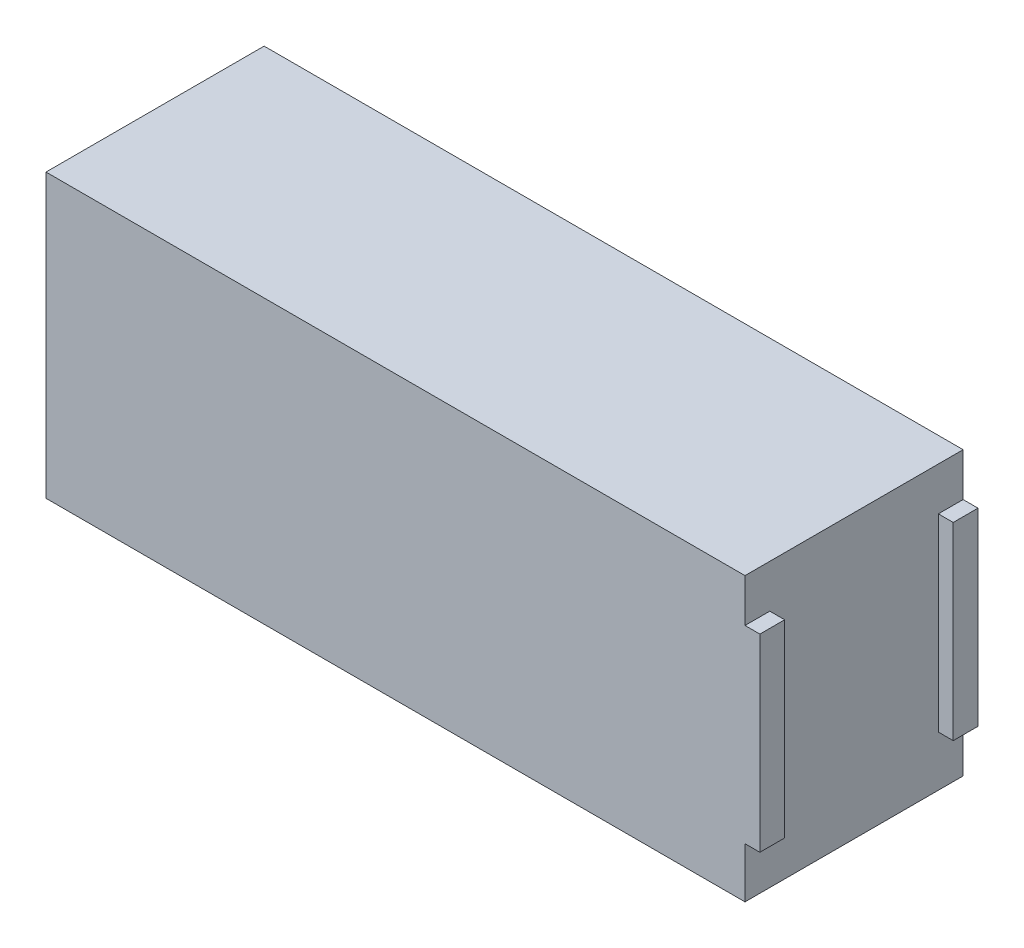
ISO-10303-21;
HEADER;
FILE_DESCRIPTION(('STEP AP214'),'2;1');
FILE_NAME('part.step','',(''),(''),'','','');
FILE_SCHEMA(('AUTOMOTIVE_DESIGN { 1 0 10303 214 1 1 1 1 }'));
ENDSEC;
DATA;
#1=APPLICATION_CONTEXT('core data for automotive mechanical design processes');
#2=APPLICATION_PROTOCOL_DEFINITION('international standard','automotive_design',2000,#1);
#3=PRODUCT_CONTEXT('',#1,'mechanical');
#4=PRODUCT('Part','Part','',(#3));
#5=PRODUCT_RELATED_PRODUCT_CATEGORY('part','',(#4));
#6=PRODUCT_DEFINITION_FORMATION('','',#4);
#7=PRODUCT_DEFINITION_CONTEXT('part definition',#1,'design');
#8=PRODUCT_DEFINITION('design','',#6,#7);
#9=PRODUCT_DEFINITION_SHAPE('','',#8);
#10=(LENGTH_UNIT() NAMED_UNIT(*) SI_UNIT(.MILLI.,.METRE.));
#11=(NAMED_UNIT(*) PLANE_ANGLE_UNIT() SI_UNIT($,.RADIAN.));
#12=(NAMED_UNIT(*) SI_UNIT($,.STERADIAN.) SOLID_ANGLE_UNIT());
#13=UNCERTAINTY_MEASURE_WITH_UNIT(LENGTH_MEASURE(1.E-05),#10,'distance_accuracy_value','');
#14=(GEOMETRIC_REPRESENTATION_CONTEXT(3) GLOBAL_UNCERTAINTY_ASSIGNED_CONTEXT((#13)) GLOBAL_UNIT_ASSIGNED_CONTEXT((#10,
#11,#12)) REPRESENTATION_CONTEXT('',''));
#15=CARTESIAN_POINT('',(0.,0.,0.));
#16=DIRECTION('',(0.,0.,1.));
#17=DIRECTION('',(1.,0.,0.));
#18=AXIS2_PLACEMENT_3D('',#15,#16,#17);
#19=CARTESIAN_POINT('',(141.,57.,0.));
#20=DIRECTION('',(-1.,0.,0.));
#21=DIRECTION('',(0.,0.,1.));
#22=AXIS2_PLACEMENT_3D('',#19,#20,#21);
#23=PLANE('',#22);
#24=DIRECTION('',(0.,0.,1.));
#25=VECTOR('',#24,1.);
#26=CARTESIAN_POINT('',(141.,48.2873752097564,-44.));
#27=LINE('',#26,#25);
#28=CARTESIAN_POINT('',(141.,48.2873752097564,-44.));
#29=VERTEX_POINT('',#28);
#30=CARTESIAN_POINT('',(141.,48.2873752097564,-39.));
#31=VERTEX_POINT('',#30);
#32=EDGE_CURVE('E145',#29,#31,#27,.T.);
#33=ORIENTED_EDGE('',*,*,#32,.F.);
#34=DIRECTION('',(0.,-1.,0.));
#35=VECTOR('',#34,1.);
#36=CARTESIAN_POINT('',(141.,57.,-44.));
#37=LINE('',#36,#35);
#38=CARTESIAN_POINT('',(141.,57.,-44.));
#39=VERTEX_POINT('',#38);
#40=EDGE_CURVE('E243',#39,#29,#37,.T.);
#41=ORIENTED_EDGE('',*,*,#40,.F.);
#42=DIRECTION('',(0.,0.,-1.));
#43=VECTOR('',#42,1.);
#44=CARTESIAN_POINT('',(141.,57.,0.));
#45=LINE('',#44,#43);
#46=CARTESIAN_POINT('',(141.,57.,0.));
#47=VERTEX_POINT('',#46);
#48=EDGE_CURVE('E221',#47,#39,#45,.T.);
#49=ORIENTED_EDGE('',*,*,#48,.F.);
#50=DIRECTION('',(0.,-1.,0.));
#51=VECTOR('',#50,1.);
#52=CARTESIAN_POINT('',(141.,57.,0.));
#53=LINE('',#52,#51);
#54=CARTESIAN_POINT('',(141.,48.2873752097564,0.));
#55=VERTEX_POINT('',#54);
#56=EDGE_CURVE('E51',#47,#55,#53,.T.);
#57=ORIENTED_EDGE('',*,*,#56,.T.);
#58=DIRECTION('',(0.,0.,1.));
#59=VECTOR('',#58,1.);
#60=CARTESIAN_POINT('',(141.,48.2873752097564,0.));
#61=LINE('',#60,#59);
#62=CARTESIAN_POINT('',(141.,48.2873752097564,-5.));
#63=VERTEX_POINT('',#62);
#64=EDGE_CURVE('E66',#63,#55,#61,.T.);
#65=ORIENTED_EDGE('',*,*,#64,.F.);
#66=DIRECTION('',(0.,1.,0.));
#67=VECTOR('',#66,1.);
#68=CARTESIAN_POINT('',(141.,48.2873752097564,-5.));
#69=LINE('',#68,#67);
#70=CARTESIAN_POINT('',(141.,10.1698345925134,-5.));
#71=VERTEX_POINT('',#70);
#72=EDGE_CURVE('E192',#71,#63,#69,.T.);
#73=ORIENTED_EDGE('',*,*,#72,.F.);
#74=DIRECTION('',(0.,0.,-1.));
#75=VECTOR('',#74,1.);
#76=CARTESIAN_POINT('',(141.,10.1698345925134,0.));
#77=LINE('',#76,#75);
#78=CARTESIAN_POINT('',(141.,10.1698345925135,0.));
#79=VERTEX_POINT('',#78);
#80=EDGE_CURVE('E167',#79,#71,#77,.T.);
#81=ORIENTED_EDGE('',*,*,#80,.F.);
#82=CARTESIAN_POINT('',(141.,0.,0.));
#83=VERTEX_POINT('',#82);
#84=EDGE_CURVE('E246',#79,#83,#53,.T.);
#85=ORIENTED_EDGE('',*,*,#84,.T.);
#86=DIRECTION('',(0.,0.,-1.));
#87=VECTOR('',#86,1.);
#88=CARTESIAN_POINT('',(141.,0.,0.));
#89=LINE('',#88,#87);
#90=CARTESIAN_POINT('',(141.,0.,-44.));
#91=VERTEX_POINT('',#90);
#92=EDGE_CURVE('E235',#83,#91,#89,.T.);
#93=ORIENTED_EDGE('',*,*,#92,.T.);
#94=CARTESIAN_POINT('',(141.,10.1698345925135,-44.));
#95=VERTEX_POINT('',#94);
#96=EDGE_CURVE('E155',#95,#91,#37,.T.);
#97=ORIENTED_EDGE('',*,*,#96,.F.);
#98=DIRECTION('',(0.,0.,-1.));
#99=VECTOR('',#98,1.);
#100=CARTESIAN_POINT('',(141.,10.1698345925135,-44.));
#101=LINE('',#100,#99);
#102=CARTESIAN_POINT('',(141.,10.1698345925135,-39.));
#103=VERTEX_POINT('',#102);
#104=EDGE_CURVE('E146',#103,#95,#101,.T.);
#105=ORIENTED_EDGE('',*,*,#104,.F.);
#106=DIRECTION('',(0.,-1.,0.));
#107=VECTOR('',#106,1.);
#108=CARTESIAN_POINT('',(141.,10.1698345925135,-39.));
#109=LINE('',#108,#107);
#110=EDGE_CURVE('E134',#31,#103,#109,.T.);
#111=ORIENTED_EDGE('',*,*,#110,.F.);
#112=EDGE_LOOP('',(#33,#41,#49,#57,#65,#73,#81,#85,#93,#97,#105,#111));
#113=FACE_BOUND('',#112,.T.);
#114=ADVANCED_FACE('F42',(#113),#23,.F.);
#115=CARTESIAN_POINT('',(0.,57.,0.));
#116=DIRECTION('',(1.,0.,0.));
#117=DIRECTION('',(0.,0.,-1.));
#118=AXIS2_PLACEMENT_3D('',#115,#116,#117);
#119=PLANE('',#118);
#120=DIRECTION('',(0.,0.,1.));
#121=VECTOR('',#120,1.);
#122=CARTESIAN_POINT('',(0.,0.,0.));
#123=LINE('',#122,#121);
#124=CARTESIAN_POINT('',(0.,0.,-44.));
#125=VERTEX_POINT('',#124);
#126=CARTESIAN_POINT('',(0.,0.,0.));
#127=VERTEX_POINT('',#126);
#128=EDGE_CURVE('E212',#125,#127,#123,.T.);
#129=ORIENTED_EDGE('',*,*,#128,.T.);
#130=DIRECTION('',(0.,-1.,0.));
#131=VECTOR('',#130,1.);
#132=CARTESIAN_POINT('',(0.,57.,0.));
#133=LINE('',#132,#131);
#134=CARTESIAN_POINT('',(0.,57.,0.));
#135=VERTEX_POINT('',#134);
#136=EDGE_CURVE('E11',#135,#127,#133,.T.);
#137=ORIENTED_EDGE('',*,*,#136,.F.);
#138=DIRECTION('',(0.,0.,1.));
#139=VECTOR('',#138,1.);
#140=CARTESIAN_POINT('',(0.,57.,0.));
#141=LINE('',#140,#139);
#142=CARTESIAN_POINT('',(0.,57.,-44.));
#143=VERTEX_POINT('',#142);
#144=EDGE_CURVE('E213',#143,#135,#141,.T.);
#145=ORIENTED_EDGE('',*,*,#144,.F.);
#146=DIRECTION('',(0.,-1.,0.));
#147=VECTOR('',#146,1.);
#148=CARTESIAN_POINT('',(0.,57.,-44.));
#149=LINE('',#148,#147);
#150=EDGE_CURVE('E227',#143,#125,#149,.T.);
#151=ORIENTED_EDGE('',*,*,#150,.T.);
#152=EDGE_LOOP('',(#129,#137,#145,#151));
#153=FACE_BOUND('',#152,.T.);
#154=ADVANCED_FACE('F44',(#153),#119,.F.);
#155=CARTESIAN_POINT('',(0.,57.,0.));
#156=DIRECTION('',(0.,0.,-1.));
#157=DIRECTION('',(-1.,0.,0.));
#158=AXIS2_PLACEMENT_3D('',#155,#156,#157);
#159=PLANE('',#158);
#160=DIRECTION('',(1.,0.,0.));
#161=VECTOR('',#160,1.);
#162=CARTESIAN_POINT('',(0.,0.,0.));
#163=LINE('',#162,#161);
#164=EDGE_CURVE('E231',#127,#83,#163,.T.);
#165=ORIENTED_EDGE('',*,*,#164,.T.);
#166=ORIENTED_EDGE('',*,*,#84,.F.);
#167=DIRECTION('',(-1.,0.,0.));
#168=VECTOR('',#167,1.);
#169=CARTESIAN_POINT('',(144.,10.1698345925134,0.));
#170=LINE('',#169,#168);
#171=CARTESIAN_POINT('',(144.,10.1698345925134,0.));
#172=VERTEX_POINT('',#171);
#173=EDGE_CURVE('E208',#172,#79,#170,.T.);
#174=ORIENTED_EDGE('',*,*,#173,.F.);
#175=DIRECTION('',(0.,-1.,0.));
#176=VECTOR('',#175,1.);
#177=CARTESIAN_POINT('',(144.,48.2873752097564,0.));
#178=LINE('',#177,#176);
#179=CARTESIAN_POINT('',(144.,48.2873752097564,0.));
#180=VERTEX_POINT('',#179);
#181=EDGE_CURVE('E175',#180,#172,#178,.T.);
#182=ORIENTED_EDGE('',*,*,#181,.F.);
#183=DIRECTION('',(-1.,0.,0.));
#184=VECTOR('',#183,1.);
#185=CARTESIAN_POINT('',(144.,48.2873752097564,0.));
#186=LINE('',#185,#184);
#187=EDGE_CURVE('E188',#180,#55,#186,.T.);
#188=ORIENTED_EDGE('',*,*,#187,.T.);
#189=ORIENTED_EDGE('',*,*,#56,.F.);
#190=DIRECTION('',(1.,0.,0.));
#191=VECTOR('',#190,1.);
#192=CARTESIAN_POINT('',(0.,57.,0.));
#193=LINE('',#192,#191);
#194=EDGE_CURVE('E217',#135,#47,#193,.T.);
#195=ORIENTED_EDGE('',*,*,#194,.F.);
#196=ORIENTED_EDGE('',*,*,#136,.T.);
#197=EDGE_LOOP('',(#165,#166,#174,#182,#188,#189,#195,#196));
#198=FACE_BOUND('',#197,.T.);
#199=ADVANCED_FACE('F256',(#198),#159,.F.);
#200=CARTESIAN_POINT('',(0.,57.,-44.));
#201=DIRECTION('',(0.,0.,1.));
#202=DIRECTION('',(1.,0.,0.));
#203=AXIS2_PLACEMENT_3D('',#200,#201,#202);
#204=PLANE('',#203);
#205=DIRECTION('',(-1.,0.,0.));
#206=VECTOR('',#205,1.);
#207=CARTESIAN_POINT('',(0.,0.,-44.));
#208=LINE('',#207,#206);
#209=EDGE_CURVE('E218',#91,#125,#208,.T.);
#210=ORIENTED_EDGE('',*,*,#209,.T.);
#211=ORIENTED_EDGE('',*,*,#150,.F.);
#212=DIRECTION('',(-1.,0.,0.));
#213=VECTOR('',#212,1.);
#214=CARTESIAN_POINT('',(0.,57.,-44.));
#215=LINE('',#214,#213);
#216=EDGE_CURVE('E224',#39,#143,#215,.T.);
#217=ORIENTED_EDGE('',*,*,#216,.F.);
#218=ORIENTED_EDGE('',*,*,#40,.T.);
#219=DIRECTION('',(-1.,0.,0.));
#220=VECTOR('',#219,1.);
#221=CARTESIAN_POINT('',(144.,48.2873752097564,-44.));
#222=LINE('',#221,#220);
#223=CARTESIAN_POINT('',(144.,48.2873752097564,-44.));
#224=VERTEX_POINT('',#223);
#225=EDGE_CURVE('E270',#224,#29,#222,.T.);
#226=ORIENTED_EDGE('',*,*,#225,.F.);
#227=DIRECTION('',(0.,1.,0.));
#228=VECTOR('',#227,1.);
#229=CARTESIAN_POINT('',(144.,10.1698345925135,-44.));
#230=LINE('',#229,#228);
#231=CARTESIAN_POINT('',(144.,10.1698345925135,-44.));
#232=VERTEX_POINT('',#231);
#233=EDGE_CURVE('E157',#232,#224,#230,.T.);
#234=ORIENTED_EDGE('',*,*,#233,.F.);
#235=DIRECTION('',(-1.,0.,0.));
#236=VECTOR('',#235,1.);
#237=CARTESIAN_POINT('',(144.,10.1698345925135,-44.));
#238=LINE('',#237,#236);
#239=EDGE_CURVE('E58',#232,#95,#238,.T.);
#240=ORIENTED_EDGE('',*,*,#239,.T.);
#241=ORIENTED_EDGE('',*,*,#96,.T.);
#242=EDGE_LOOP('',(#210,#211,#217,#218,#226,#234,#240,#241));
#243=FACE_BOUND('',#242,.T.);
#244=ADVANCED_FACE('F262',(#243),#204,.F.);
#245=CARTESIAN_POINT('',(0.,57.,0.));
#246=DIRECTION('',(0.,-1.,0.));
#247=DIRECTION('',(0.,0.,-1.));
#248=AXIS2_PLACEMENT_3D('',#245,#246,#247);
#249=PLANE('',#248);
#250=ORIENTED_EDGE('',*,*,#144,.T.);
#251=ORIENTED_EDGE('',*,*,#194,.T.);
#252=ORIENTED_EDGE('',*,*,#48,.T.);
#253=ORIENTED_EDGE('',*,*,#216,.T.);
#254=EDGE_LOOP('',(#250,#251,#252,#253));
#255=FACE_BOUND('',#254,.T.);
#256=ADVANCED_FACE('F267',(#255),#249,.F.);
#257=CARTESIAN_POINT('',(0.,0.,0.));
#258=DIRECTION('',(0.,-1.,0.));
#259=DIRECTION('',(0.,0.,-1.));
#260=AXIS2_PLACEMENT_3D('',#257,#258,#259);
#261=PLANE('',#260);
#262=ORIENTED_EDGE('',*,*,#128,.F.);
#263=ORIENTED_EDGE('',*,*,#209,.F.);
#264=ORIENTED_EDGE('',*,*,#92,.F.);
#265=ORIENTED_EDGE('',*,*,#164,.F.);
#266=EDGE_LOOP('',(#262,#263,#264,#265));
#267=FACE_BOUND('',#266,.T.);
#268=ADVANCED_FACE('F260',(#267),#261,.T.);
#269=CARTESIAN_POINT('',(144.,10.1698345925134,0.));
#270=DIRECTION('',(0.,1.,0.));
#271=DIRECTION('',(0.,0.,1.));
#272=AXIS2_PLACEMENT_3D('',#269,#270,#271);
#273=PLANE('',#272);
#274=ORIENTED_EDGE('',*,*,#80,.T.);
#275=DIRECTION('',(-1.,0.,0.));
#276=VECTOR('',#275,1.);
#277=CARTESIAN_POINT('',(144.,10.1698345925134,-5.));
#278=LINE('',#277,#276);
#279=CARTESIAN_POINT('',(144.,10.1698345925134,-5.));
#280=VERTEX_POINT('',#279);
#281=EDGE_CURVE('E204',#280,#71,#278,.T.);
#282=ORIENTED_EDGE('',*,*,#281,.F.);
#283=DIRECTION('',(0.,0.,-1.));
#284=VECTOR('',#283,1.);
#285=CARTESIAN_POINT('',(144.,10.1698345925134,0.));
#286=LINE('',#285,#284);
#287=EDGE_CURVE('E179',#172,#280,#286,.T.);
#288=ORIENTED_EDGE('',*,*,#287,.F.);
#289=ORIENTED_EDGE('',*,*,#173,.T.);
#290=EDGE_LOOP('',(#274,#282,#288,#289));
#291=FACE_BOUND('',#290,.T.);
#292=ADVANCED_FACE('F305',(#291),#273,.F.);
#293=CARTESIAN_POINT('',(144.,48.2873752097564,-5.));
#294=DIRECTION('',(0.,0.,1.));
#295=DIRECTION('',(0.,-1.,0.));
#296=AXIS2_PLACEMENT_3D('',#293,#294,#295);
#297=PLANE('',#296);
#298=ORIENTED_EDGE('',*,*,#72,.T.);
#299=DIRECTION('',(-1.,0.,0.));
#300=VECTOR('',#299,1.);
#301=CARTESIAN_POINT('',(144.,48.2873752097564,-5.));
#302=LINE('',#301,#300);
#303=CARTESIAN_POINT('',(144.,48.2873752097564,-5.));
#304=VERTEX_POINT('',#303);
#305=EDGE_CURVE('E200',#304,#63,#302,.T.);
#306=ORIENTED_EDGE('',*,*,#305,.F.);
#307=DIRECTION('',(0.,1.,0.));
#308=VECTOR('',#307,1.);
#309=CARTESIAN_POINT('',(144.,48.2873752097564,-5.));
#310=LINE('',#309,#308);
#311=EDGE_CURVE('E182',#280,#304,#310,.T.);
#312=ORIENTED_EDGE('',*,*,#311,.F.);
#313=ORIENTED_EDGE('',*,*,#281,.T.);
#314=EDGE_LOOP('',(#298,#306,#312,#313));
#315=FACE_BOUND('',#314,.T.);
#316=ADVANCED_FACE('F309',(#315),#297,.F.);
#317=CARTESIAN_POINT('',(144.,48.2873752097564,0.));
#318=DIRECTION('',(0.,-1.,0.));
#319=DIRECTION('',(0.,0.,-1.));
#320=AXIS2_PLACEMENT_3D('',#317,#318,#319);
#321=PLANE('',#320);
#322=ORIENTED_EDGE('',*,*,#64,.T.);
#323=ORIENTED_EDGE('',*,*,#187,.F.);
#324=DIRECTION('',(0.,0.,1.));
#325=VECTOR('',#324,1.);
#326=CARTESIAN_POINT('',(144.,48.2873752097564,0.));
#327=LINE('',#326,#325);
#328=EDGE_CURVE('E185',#304,#180,#327,.T.);
#329=ORIENTED_EDGE('',*,*,#328,.F.);
#330=ORIENTED_EDGE('',*,*,#305,.T.);
#331=EDGE_LOOP('',(#322,#323,#329,#330));
#332=FACE_BOUND('',#331,.T.);
#333=ADVANCED_FACE('F313',(#332),#321,.F.);
#334=CARTESIAN_POINT('',(144.,0.,0.));
#335=DIRECTION('',(1.,0.,0.));
#336=DIRECTION('',(0.,0.,-1.));
#337=AXIS2_PLACEMENT_3D('',#334,#335,#336);
#338=PLANE('',#337);
#339=ORIENTED_EDGE('',*,*,#181,.T.);
#340=ORIENTED_EDGE('',*,*,#287,.T.);
#341=ORIENTED_EDGE('',*,*,#311,.T.);
#342=ORIENTED_EDGE('',*,*,#328,.T.);
#343=EDGE_LOOP('',(#339,#340,#341,#342));
#344=FACE_BOUND('',#343,.T.);
#345=ADVANCED_FACE('F316',(#344),#338,.T.);
#346=CARTESIAN_POINT('',(144.,48.2873752097564,-44.));
#347=DIRECTION('',(0.,-1.,0.));
#348=DIRECTION('',(0.,0.,-1.));
#349=AXIS2_PLACEMENT_3D('',#346,#347,#348);
#350=PLANE('',#349);
#351=ORIENTED_EDGE('',*,*,#32,.T.);
#352=DIRECTION('',(-1.,0.,0.));
#353=VECTOR('',#352,1.);
#354=CARTESIAN_POINT('',(144.,48.2873752097564,-39.));
#355=LINE('',#354,#353);
#356=CARTESIAN_POINT('',(144.,48.2873752097564,-39.));
#357=VERTEX_POINT('',#356);
#358=EDGE_CURVE('E141',#357,#31,#355,.T.);
#359=ORIENTED_EDGE('',*,*,#358,.F.);
#360=DIRECTION('',(0.,0.,1.));
#361=VECTOR('',#360,1.);
#362=CARTESIAN_POINT('',(144.,48.2873752097564,-44.));
#363=LINE('',#362,#361);
#364=EDGE_CURVE('E161',#224,#357,#363,.T.);
#365=ORIENTED_EDGE('',*,*,#364,.F.);
#366=ORIENTED_EDGE('',*,*,#225,.T.);
#367=EDGE_LOOP('',(#351,#359,#365,#366));
#368=FACE_BOUND('',#367,.T.);
#369=ADVANCED_FACE('F272',(#368),#350,.F.);
#370=CARTESIAN_POINT('',(144.,10.1698345925135,-39.));
#371=DIRECTION('',(0.,0.,-1.));
#372=DIRECTION('',(-1.,0.,0.));
#373=AXIS2_PLACEMENT_3D('',#370,#371,#372);
#374=PLANE('',#373);
#375=ORIENTED_EDGE('',*,*,#110,.T.);
#376=DIRECTION('',(-1.,0.,0.));
#377=VECTOR('',#376,1.);
#378=CARTESIAN_POINT('',(144.,10.1698345925135,-39.));
#379=LINE('',#378,#377);
#380=CARTESIAN_POINT('',(144.,10.1698345925135,-39.));
#381=VERTEX_POINT('',#380);
#382=EDGE_CURVE('E138',#381,#103,#379,.T.);
#383=ORIENTED_EDGE('',*,*,#382,.F.);
#384=DIRECTION('',(0.,-1.,0.));
#385=VECTOR('',#384,1.);
#386=CARTESIAN_POINT('',(144.,10.1698345925135,-39.));
#387=LINE('',#386,#385);
#388=EDGE_CURVE('E170',#357,#381,#387,.T.);
#389=ORIENTED_EDGE('',*,*,#388,.F.);
#390=ORIENTED_EDGE('',*,*,#358,.T.);
#391=EDGE_LOOP('',(#375,#383,#389,#390));
#392=FACE_BOUND('',#391,.T.);
#393=ADVANCED_FACE('F136',(#392),#374,.F.);
#394=CARTESIAN_POINT('',(144.,10.1698345925135,-44.));
#395=DIRECTION('',(0.,1.,0.));
#396=DIRECTION('',(0.,0.,1.));
#397=AXIS2_PLACEMENT_3D('',#394,#395,#396);
#398=PLANE('',#397);
#399=ORIENTED_EDGE('',*,*,#104,.T.);
#400=ORIENTED_EDGE('',*,*,#239,.F.);
#401=DIRECTION('',(0.,0.,-1.));
#402=VECTOR('',#401,1.);
#403=CARTESIAN_POINT('',(144.,10.1698345925135,-44.));
#404=LINE('',#403,#402);
#405=EDGE_CURVE('E151',#381,#232,#404,.T.);
#406=ORIENTED_EDGE('',*,*,#405,.F.);
#407=ORIENTED_EDGE('',*,*,#382,.T.);
#408=EDGE_LOOP('',(#399,#400,#406,#407));
#409=FACE_BOUND('',#408,.T.);
#410=ADVANCED_FACE('F149',(#409),#398,.F.);
#411=CARTESIAN_POINT('',(144.,0.,0.));
#412=DIRECTION('',(1.,0.,0.));
#413=DIRECTION('',(0.,0.,-1.));
#414=AXIS2_PLACEMENT_3D('',#411,#412,#413);
#415=PLANE('',#414);
#416=ORIENTED_EDGE('',*,*,#233,.T.);
#417=ORIENTED_EDGE('',*,*,#364,.T.);
#418=ORIENTED_EDGE('',*,*,#388,.T.);
#419=ORIENTED_EDGE('',*,*,#405,.T.);
#420=EDGE_LOOP('',(#416,#417,#418,#419));
#421=FACE_BOUND('',#420,.T.);
#422=ADVANCED_FACE('F279',(#421),#415,.T.);
#423=CLOSED_SHELL('',(#114,#154,#199,#244,#256,#268,#292,#316,#333,#345,#369,#393,#410,#422));
#424=MANIFOLD_SOLID_BREP('B2',#423);
#425=ADVANCED_BREP_SHAPE_REPRESENTATION('',(#18,#424),#14);
#426=SHAPE_DEFINITION_REPRESENTATION(#9,#425);
ENDSEC;
END-ISO-10303-21;
